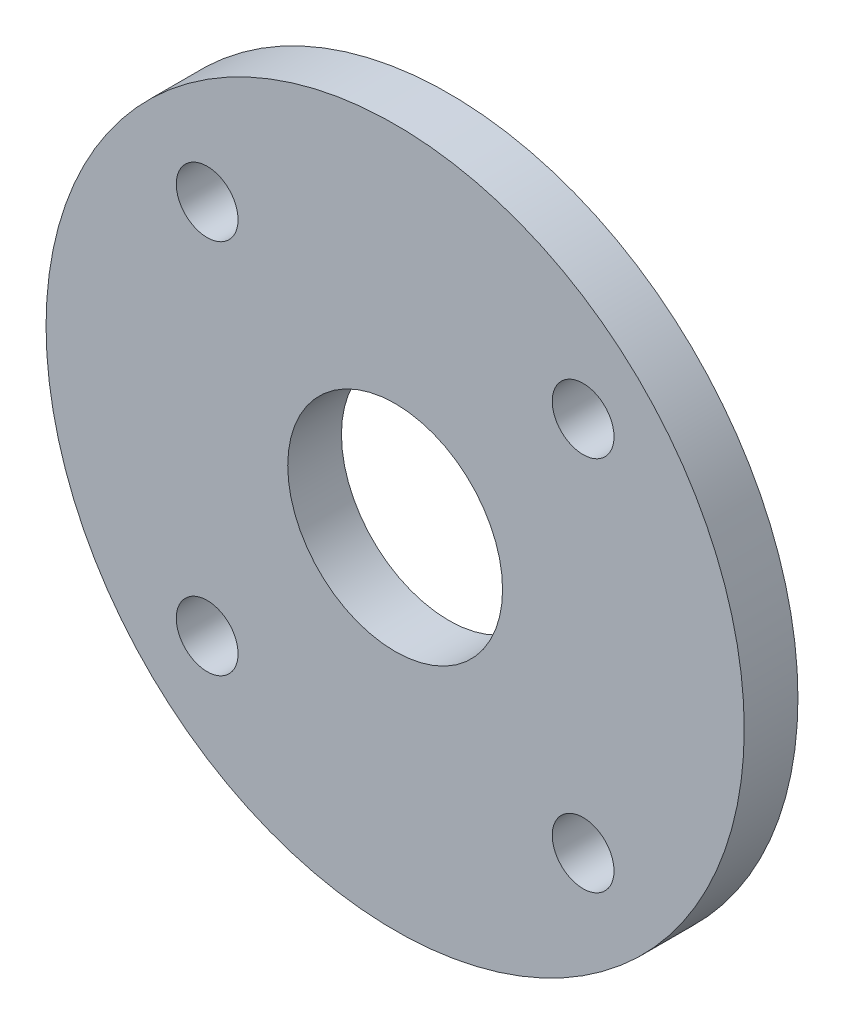
ISO-10303-21;
HEADER;
FILE_DESCRIPTION(('STEP AP214'),'2;1');
FILE_NAME('part.step','',(''),(''),'','','');
FILE_SCHEMA(('AUTOMOTIVE_DESIGN { 1 0 10303 214 1 1 1 1 }'));
ENDSEC;
DATA;
#1=APPLICATION_CONTEXT('core data for automotive mechanical design processes');
#2=APPLICATION_PROTOCOL_DEFINITION('international standard','automotive_design',2000,#1);
#3=PRODUCT_CONTEXT('',#1,'mechanical');
#4=PRODUCT('Part','Part','',(#3));
#5=PRODUCT_RELATED_PRODUCT_CATEGORY('part','',(#4));
#6=PRODUCT_DEFINITION_FORMATION('','',#4);
#7=PRODUCT_DEFINITION_CONTEXT('part definition',#1,'design');
#8=PRODUCT_DEFINITION('design','',#6,#7);
#9=PRODUCT_DEFINITION_SHAPE('','',#8);
#10=(LENGTH_UNIT() NAMED_UNIT(*) SI_UNIT(.MILLI.,.METRE.));
#11=(NAMED_UNIT(*) PLANE_ANGLE_UNIT() SI_UNIT($,.RADIAN.));
#12=(NAMED_UNIT(*) SI_UNIT($,.STERADIAN.) SOLID_ANGLE_UNIT());
#13=UNCERTAINTY_MEASURE_WITH_UNIT(LENGTH_MEASURE(1.E-05),#10,'distance_accuracy_value','');
#14=(GEOMETRIC_REPRESENTATION_CONTEXT(3) GLOBAL_UNCERTAINTY_ASSIGNED_CONTEXT((#13)) GLOBAL_UNIT_ASSIGNED_CONTEXT((#10,
#11,#12)) REPRESENTATION_CONTEXT('',''));
#15=CARTESIAN_POINT('',(0.,0.,0.));
#16=DIRECTION('',(0.,0.,1.));
#17=DIRECTION('',(1.,0.,0.));
#18=AXIS2_PLACEMENT_3D('',#15,#16,#17);
#19=CARTESIAN_POINT('',(0.,0.,2.));
#20=DIRECTION('',(0.,0.,1.));
#21=DIRECTION('',(1.,0.,0.));
#22=AXIS2_PLACEMENT_3D('',#19,#20,#21);
#23=PLANE('',#22);
#24=CARTESIAN_POINT('',(7.,-7.,2.));
#25=DIRECTION('',(0.,0.,1.));
#26=DIRECTION('',(1.,0.,0.));
#27=AXIS2_PLACEMENT_3D('',#24,#25,#26);
#28=CIRCLE('',#27,1.15);
#29=CARTESIAN_POINT('',(8.15,-7.,2.));
#30=VERTEX_POINT('',#29);
#31=EDGE_CURVE('E72',#30,#30,#28,.T.);
#32=ORIENTED_EDGE('',*,*,#31,.F.);
#33=EDGE_LOOP('',(#32));
#34=FACE_BOUND('',#33,.T.);
#35=CARTESIAN_POINT('',(-7.,-7.,2.));
#36=DIRECTION('',(0.,0.,1.));
#37=DIRECTION('',(1.,0.,0.));
#38=AXIS2_PLACEMENT_3D('',#35,#36,#37);
#39=CIRCLE('',#38,1.15);
#40=CARTESIAN_POINT('',(-5.85,-7.,2.));
#41=VERTEX_POINT('',#40);
#42=EDGE_CURVE('E73',#41,#41,#39,.T.);
#43=ORIENTED_EDGE('',*,*,#42,.F.);
#44=EDGE_LOOP('',(#43));
#45=FACE_BOUND('',#44,.T.);
#46=CARTESIAN_POINT('',(-7.,7.,2.));
#47=DIRECTION('',(0.,0.,1.));
#48=DIRECTION('',(1.,0.,0.));
#49=AXIS2_PLACEMENT_3D('',#46,#47,#48);
#50=CIRCLE('',#49,1.15);
#51=CARTESIAN_POINT('',(-5.85,7.,2.));
#52=VERTEX_POINT('',#51);
#53=EDGE_CURVE('E78',#52,#52,#50,.T.);
#54=ORIENTED_EDGE('',*,*,#53,.F.);
#55=EDGE_LOOP('',(#54));
#56=FACE_BOUND('',#55,.T.);
#57=CARTESIAN_POINT('',(7.,7.,2.));
#58=DIRECTION('',(0.,0.,1.));
#59=DIRECTION('',(1.,0.,0.));
#60=AXIS2_PLACEMENT_3D('',#57,#58,#59);
#61=CIRCLE('',#60,1.15);
#62=CARTESIAN_POINT('',(8.15,7.,2.));
#63=VERTEX_POINT('',#62);
#64=EDGE_CURVE('E83',#63,#63,#61,.T.);
#65=ORIENTED_EDGE('',*,*,#64,.F.);
#66=EDGE_LOOP('',(#65));
#67=FACE_BOUND('',#66,.T.);
#68=CARTESIAN_POINT('',(0.,0.,2.));
#69=DIRECTION('',(0.,0.,1.));
#70=DIRECTION('',(1.,0.,0.));
#71=AXIS2_PLACEMENT_3D('',#68,#69,#70);
#72=CIRCLE('',#71,13.);
#73=CARTESIAN_POINT('',(13.,0.,2.));
#74=VERTEX_POINT('',#73);
#75=EDGE_CURVE('E10',#74,#74,#72,.T.);
#76=ORIENTED_EDGE('',*,*,#75,.T.);
#77=EDGE_LOOP('',(#76));
#78=FACE_BOUND('',#77,.T.);
#79=CARTESIAN_POINT('',(0.,0.,2.));
#80=DIRECTION('',(0.,0.,1.));
#81=DIRECTION('',(1.,0.,0.));
#82=AXIS2_PLACEMENT_3D('',#79,#80,#81);
#83=CIRCLE('',#82,4.);
#84=CARTESIAN_POINT('',(4.,0.,2.));
#85=VERTEX_POINT('',#84);
#86=EDGE_CURVE('E53',#85,#85,#83,.T.);
#87=ORIENTED_EDGE('',*,*,#86,.F.);
#88=EDGE_LOOP('',(#87));
#89=FACE_BOUND('',#88,.T.);
#90=ADVANCED_FACE('F41',(#34,#45,#56,#67,#78,#89),#23,.T.);
#91=CARTESIAN_POINT('',(0.,0.,0.));
#92=DIRECTION('',(0.,0.,1.));
#93=DIRECTION('',(1.,0.,0.));
#94=AXIS2_PLACEMENT_3D('',#91,#92,#93);
#95=PLANE('',#94);
#96=CARTESIAN_POINT('',(7.,-7.,0.));
#97=DIRECTION('',(0.,0.,1.));
#98=DIRECTION('',(1.,0.,0.));
#99=AXIS2_PLACEMENT_3D('',#96,#97,#98);
#100=CIRCLE('',#99,2.1);
#101=CARTESIAN_POINT('',(9.1,-7.,0.));
#102=VERTEX_POINT('',#101);
#103=EDGE_CURVE('E134',#102,#102,#100,.T.);
#104=ORIENTED_EDGE('',*,*,#103,.T.);
#105=EDGE_LOOP('',(#104));
#106=FACE_BOUND('',#105,.T.);
#107=CARTESIAN_POINT('',(-7.,-7.,0.));
#108=DIRECTION('',(0.,0.,1.));
#109=DIRECTION('',(1.,0.,0.));
#110=AXIS2_PLACEMENT_3D('',#107,#108,#109);
#111=CIRCLE('',#110,2.1);
#112=CARTESIAN_POINT('',(-4.9,-7.,0.));
#113=VERTEX_POINT('',#112);
#114=EDGE_CURVE('E138',#113,#113,#111,.T.);
#115=ORIENTED_EDGE('',*,*,#114,.T.);
#116=EDGE_LOOP('',(#115));
#117=FACE_BOUND('',#116,.T.);
#118=CARTESIAN_POINT('',(-7.,7.,0.));
#119=DIRECTION('',(0.,0.,1.));
#120=DIRECTION('',(1.,0.,0.));
#121=AXIS2_PLACEMENT_3D('',#118,#119,#120);
#122=CIRCLE('',#121,2.1);
#123=CARTESIAN_POINT('',(-4.9,7.,0.));
#124=VERTEX_POINT('',#123);
#125=EDGE_CURVE('E130',#124,#124,#122,.T.);
#126=ORIENTED_EDGE('',*,*,#125,.T.);
#127=EDGE_LOOP('',(#126));
#128=FACE_BOUND('',#127,.T.);
#129=CARTESIAN_POINT('',(7.,7.,0.));
#130=DIRECTION('',(0.,0.,1.));
#131=DIRECTION('',(1.,0.,0.));
#132=AXIS2_PLACEMENT_3D('',#129,#130,#131);
#133=CIRCLE('',#132,2.1);
#134=CARTESIAN_POINT('',(9.1,7.,0.));
#135=VERTEX_POINT('',#134);
#136=EDGE_CURVE('E123',#135,#135,#133,.T.);
#137=ORIENTED_EDGE('',*,*,#136,.T.);
#138=EDGE_LOOP('',(#137));
#139=FACE_BOUND('',#138,.T.);
#140=CARTESIAN_POINT('',(0.,0.,0.));
#141=DIRECTION('',(0.,0.,1.));
#142=DIRECTION('',(1.,0.,0.));
#143=AXIS2_PLACEMENT_3D('',#140,#141,#142);
#144=CIRCLE('',#143,13.);
#145=CARTESIAN_POINT('',(13.,0.,0.));
#146=VERTEX_POINT('',#145);
#147=EDGE_CURVE('E47',#146,#146,#144,.T.);
#148=ORIENTED_EDGE('',*,*,#147,.F.);
#149=EDGE_LOOP('',(#148));
#150=FACE_BOUND('',#149,.T.);
#151=CARTESIAN_POINT('',(0.,0.,0.));
#152=DIRECTION('',(0.,0.,1.));
#153=DIRECTION('',(1.,0.,0.));
#154=AXIS2_PLACEMENT_3D('',#151,#152,#153);
#155=CIRCLE('',#154,4.);
#156=CARTESIAN_POINT('',(4.,0.,0.));
#157=VERTEX_POINT('',#156);
#158=EDGE_CURVE('E60',#157,#157,#155,.T.);
#159=ORIENTED_EDGE('',*,*,#158,.T.);
#160=EDGE_LOOP('',(#159));
#161=FACE_BOUND('',#160,.T.);
#162=ADVANCED_FACE('F95',(#106,#117,#128,#139,#150,#161),#95,.F.);
#163=CARTESIAN_POINT('',(0.,0.,2.));
#164=DIRECTION('',(0.,0.,-1.));
#165=DIRECTION('',(-1.,0.,0.));
#166=AXIS2_PLACEMENT_3D('',#163,#164,#165);
#167=CYLINDRICAL_SURFACE('',#166,13.);
#168=ORIENTED_EDGE('',*,*,#75,.F.);
#169=EDGE_LOOP('',(#168));
#170=FACE_BOUND('',#169,.T.);
#171=ORIENTED_EDGE('',*,*,#147,.T.);
#172=EDGE_LOOP('',(#171));
#173=FACE_BOUND('',#172,.T.);
#174=ADVANCED_FACE('F43',(#170,#173),#167,.T.);
#175=CARTESIAN_POINT('',(0.,0.,2.));
#176=DIRECTION('',(0.,0.,-1.));
#177=DIRECTION('',(-1.,0.,0.));
#178=AXIS2_PLACEMENT_3D('',#175,#176,#177);
#179=CYLINDRICAL_SURFACE('',#178,4.);
#180=ORIENTED_EDGE('',*,*,#86,.T.);
#181=EDGE_LOOP('',(#180));
#182=FACE_BOUND('',#181,.T.);
#183=ORIENTED_EDGE('',*,*,#158,.F.);
#184=EDGE_LOOP('',(#183));
#185=FACE_BOUND('',#184,.T.);
#186=ADVANCED_FACE('F94',(#182,#185),#179,.F.);
#187=CARTESIAN_POINT('',(7.,7.,2.));
#188=DIRECTION('',(0.,0.,-1.));
#189=DIRECTION('',(-1.,0.,0.));
#190=AXIS2_PLACEMENT_3D('',#187,#188,#189);
#191=CYLINDRICAL_SURFACE('',#190,1.15);
#192=CARTESIAN_POINT('',(7.,7.,0.35));
#193=DIRECTION('',(0.,0.,1.));
#194=DIRECTION('',(1.,0.,0.));
#195=AXIS2_PLACEMENT_3D('',#192,#193,#194);
#196=CIRCLE('',#195,1.15);
#197=CARTESIAN_POINT('',(8.15,7.,0.35));
#198=VERTEX_POINT('',#197);
#199=EDGE_CURVE('E44',#198,#198,#196,.T.);
#200=ORIENTED_EDGE('',*,*,#199,.F.);
#201=EDGE_LOOP('',(#200));
#202=FACE_BOUND('',#201,.T.);
#203=ORIENTED_EDGE('',*,*,#64,.T.);
#204=EDGE_LOOP('',(#203));
#205=FACE_BOUND('',#204,.T.);
#206=ADVANCED_FACE('F96',(#202,#205),#191,.F.);
#207=CARTESIAN_POINT('',(-7.,7.,2.));
#208=DIRECTION('',(0.,0.,-1.));
#209=DIRECTION('',(-1.,0.,0.));
#210=AXIS2_PLACEMENT_3D('',#207,#208,#209);
#211=CYLINDRICAL_SURFACE('',#210,1.15);
#212=CARTESIAN_POINT('',(-7.,7.,0.35));
#213=DIRECTION('',(0.,0.,1.));
#214=DIRECTION('',(1.,0.,0.));
#215=AXIS2_PLACEMENT_3D('',#212,#213,#214);
#216=CIRCLE('',#215,1.15);
#217=CARTESIAN_POINT('',(-5.85,7.,0.35));
#218=VERTEX_POINT('',#217);
#219=EDGE_CURVE('E66',#218,#218,#216,.T.);
#220=ORIENTED_EDGE('',*,*,#219,.F.);
#221=EDGE_LOOP('',(#220));
#222=FACE_BOUND('',#221,.T.);
#223=ORIENTED_EDGE('',*,*,#53,.T.);
#224=EDGE_LOOP('',(#223));
#225=FACE_BOUND('',#224,.T.);
#226=ADVANCED_FACE('F103',(#222,#225),#211,.F.);
#227=CARTESIAN_POINT('',(-7.,-7.,2.));
#228=DIRECTION('',(0.,0.,-1.));
#229=DIRECTION('',(-1.,0.,0.));
#230=AXIS2_PLACEMENT_3D('',#227,#228,#229);
#231=CYLINDRICAL_SURFACE('',#230,1.15);
#232=CARTESIAN_POINT('',(-7.,-7.,0.35));
#233=DIRECTION('',(0.,0.,1.));
#234=DIRECTION('',(1.,0.,0.));
#235=AXIS2_PLACEMENT_3D('',#232,#233,#234);
#236=CIRCLE('',#235,1.15);
#237=CARTESIAN_POINT('',(-5.85,-7.,0.35));
#238=VERTEX_POINT('',#237);
#239=EDGE_CURVE('E64',#238,#238,#236,.T.);
#240=ORIENTED_EDGE('',*,*,#239,.F.);
#241=EDGE_LOOP('',(#240));
#242=FACE_BOUND('',#241,.T.);
#243=ORIENTED_EDGE('',*,*,#42,.T.);
#244=EDGE_LOOP('',(#243));
#245=FACE_BOUND('',#244,.T.);
#246=ADVANCED_FACE('F187',(#242,#245),#231,.F.);
#247=CARTESIAN_POINT('',(7.,-7.,2.));
#248=DIRECTION('',(0.,0.,-1.));
#249=DIRECTION('',(-1.,0.,0.));
#250=AXIS2_PLACEMENT_3D('',#247,#248,#249);
#251=CYLINDRICAL_SURFACE('',#250,1.15);
#252=CARTESIAN_POINT('',(7.,-7.,0.35));
#253=DIRECTION('',(0.,0.,1.));
#254=DIRECTION('',(1.,0.,0.));
#255=AXIS2_PLACEMENT_3D('',#252,#253,#254);
#256=CIRCLE('',#255,1.15);
#257=CARTESIAN_POINT('',(8.15,-7.,0.35));
#258=VERTEX_POINT('',#257);
#259=EDGE_CURVE('E58',#258,#258,#256,.T.);
#260=ORIENTED_EDGE('',*,*,#259,.F.);
#261=EDGE_LOOP('',(#260));
#262=FACE_BOUND('',#261,.T.);
#263=ORIENTED_EDGE('',*,*,#31,.T.);
#264=EDGE_LOOP('',(#263));
#265=FACE_BOUND('',#264,.T.);
#266=ADVANCED_FACE('F174',(#262,#265),#251,.F.);
#267=CARTESIAN_POINT('',(7.,-7.,0.35));
#268=DIRECTION('',(0.,0.,-1.));
#269=DIRECTION('',(-1.,0.,0.));
#270=AXIS2_PLACEMENT_3D('',#267,#268,#269);
#271=CYLINDRICAL_SURFACE('',#270,2.1);
#272=CARTESIAN_POINT('',(7.,-7.,0.35));
#273=DIRECTION('',(0.,0.,1.));
#274=DIRECTION('',(1.,0.,0.));
#275=AXIS2_PLACEMENT_3D('',#272,#273,#274);
#276=CIRCLE('',#275,2.1);
#277=CARTESIAN_POINT('',(9.1,-7.,0.35));
#278=VERTEX_POINT('',#277);
#279=EDGE_CURVE('E128',#278,#278,#276,.T.);
#280=ORIENTED_EDGE('',*,*,#279,.T.);
#281=EDGE_LOOP('',(#280));
#282=FACE_BOUND('',#281,.T.);
#283=ORIENTED_EDGE('',*,*,#103,.F.);
#284=EDGE_LOOP('',(#283));
#285=FACE_BOUND('',#284,.T.);
#286=ADVANCED_FACE('F168',(#282,#285),#271,.F.);
#287=CARTESIAN_POINT('',(7.,-7.,0.35));
#288=DIRECTION('',(0.,0.,1.));
#289=DIRECTION('',(1.,0.,0.));
#290=AXIS2_PLACEMENT_3D('',#287,#288,#289);
#291=PLANE('',#290);
#292=ORIENTED_EDGE('',*,*,#259,.T.);
#293=EDGE_LOOP('',(#292));
#294=FACE_BOUND('',#293,.T.);
#295=ORIENTED_EDGE('',*,*,#279,.F.);
#296=EDGE_LOOP('',(#295));
#297=FACE_BOUND('',#296,.T.);
#298=ADVANCED_FACE('F170',(#294,#297),#291,.F.);
#299=CARTESIAN_POINT('',(-7.,-7.,0.35));
#300=DIRECTION('',(0.,0.,-1.));
#301=DIRECTION('',(-1.,0.,0.));
#302=AXIS2_PLACEMENT_3D('',#299,#300,#301);
#303=CYLINDRICAL_SURFACE('',#302,2.1);
#304=CARTESIAN_POINT('',(-7.,-7.,0.35));
#305=DIRECTION('',(0.,0.,1.));
#306=DIRECTION('',(1.,0.,0.));
#307=AXIS2_PLACEMENT_3D('',#304,#305,#306);
#308=CIRCLE('',#307,2.1);
#309=CARTESIAN_POINT('',(-4.9,-7.,0.35));
#310=VERTEX_POINT('',#309);
#311=EDGE_CURVE('E136',#310,#310,#308,.T.);
#312=ORIENTED_EDGE('',*,*,#311,.T.);
#313=EDGE_LOOP('',(#312));
#314=FACE_BOUND('',#313,.T.);
#315=ORIENTED_EDGE('',*,*,#114,.F.);
#316=EDGE_LOOP('',(#315));
#317=FACE_BOUND('',#316,.T.);
#318=ADVANCED_FACE('F165',(#314,#317),#303,.F.);
#319=CARTESIAN_POINT('',(-7.,-7.,0.35));
#320=DIRECTION('',(0.,0.,1.));
#321=DIRECTION('',(1.,0.,0.));
#322=AXIS2_PLACEMENT_3D('',#319,#320,#321);
#323=PLANE('',#322);
#324=ORIENTED_EDGE('',*,*,#239,.T.);
#325=EDGE_LOOP('',(#324));
#326=FACE_BOUND('',#325,.T.);
#327=ORIENTED_EDGE('',*,*,#311,.F.);
#328=EDGE_LOOP('',(#327));
#329=FACE_BOUND('',#328,.T.);
#330=ADVANCED_FACE('F153',(#326,#329),#323,.F.);
#331=CARTESIAN_POINT('',(-7.,7.,0.35));
#332=DIRECTION('',(0.,0.,-1.));
#333=DIRECTION('',(-1.,0.,0.));
#334=AXIS2_PLACEMENT_3D('',#331,#332,#333);
#335=CYLINDRICAL_SURFACE('',#334,2.1);
#336=CARTESIAN_POINT('',(-7.,7.,0.35));
#337=DIRECTION('',(0.,0.,1.));
#338=DIRECTION('',(1.,0.,0.));
#339=AXIS2_PLACEMENT_3D('',#336,#337,#338);
#340=CIRCLE('',#339,2.1);
#341=CARTESIAN_POINT('',(-4.9,7.,0.35));
#342=VERTEX_POINT('',#341);
#343=EDGE_CURVE('E142',#342,#342,#340,.T.);
#344=ORIENTED_EDGE('',*,*,#343,.T.);
#345=EDGE_LOOP('',(#344));
#346=FACE_BOUND('',#345,.T.);
#347=ORIENTED_EDGE('',*,*,#125,.F.);
#348=EDGE_LOOP('',(#347));
#349=FACE_BOUND('',#348,.T.);
#350=ADVANCED_FACE('F147',(#346,#349),#335,.F.);
#351=CARTESIAN_POINT('',(-7.,7.,0.35));
#352=DIRECTION('',(0.,0.,1.));
#353=DIRECTION('',(1.,0.,0.));
#354=AXIS2_PLACEMENT_3D('',#351,#352,#353);
#355=PLANE('',#354);
#356=ORIENTED_EDGE('',*,*,#219,.T.);
#357=EDGE_LOOP('',(#356));
#358=FACE_BOUND('',#357,.T.);
#359=ORIENTED_EDGE('',*,*,#343,.F.);
#360=EDGE_LOOP('',(#359));
#361=FACE_BOUND('',#360,.T.);
#362=ADVANCED_FACE('F155',(#358,#361),#355,.F.);
#363=CARTESIAN_POINT('',(7.,7.,0.35));
#364=DIRECTION('',(0.,0.,-1.));
#365=DIRECTION('',(-1.,0.,0.));
#366=AXIS2_PLACEMENT_3D('',#363,#364,#365);
#367=CYLINDRICAL_SURFACE('',#366,2.1);
#368=CARTESIAN_POINT('',(7.,7.,0.35));
#369=DIRECTION('',(0.,0.,1.));
#370=DIRECTION('',(1.,0.,0.));
#371=AXIS2_PLACEMENT_3D('',#368,#369,#370);
#372=CIRCLE('',#371,2.1);
#373=CARTESIAN_POINT('',(9.1,7.,0.35));
#374=VERTEX_POINT('',#373);
#375=EDGE_CURVE('E61',#374,#374,#372,.T.);
#376=ORIENTED_EDGE('',*,*,#375,.T.);
#377=EDGE_LOOP('',(#376));
#378=FACE_BOUND('',#377,.T.);
#379=ORIENTED_EDGE('',*,*,#136,.F.);
#380=EDGE_LOOP('',(#379));
#381=FACE_BOUND('',#380,.T.);
#382=ADVANCED_FACE('F159',(#378,#381),#367,.F.);
#383=CARTESIAN_POINT('',(7.,7.,0.35));
#384=DIRECTION('',(0.,0.,1.));
#385=DIRECTION('',(1.,0.,0.));
#386=AXIS2_PLACEMENT_3D('',#383,#384,#385);
#387=PLANE('',#386);
#388=ORIENTED_EDGE('',*,*,#199,.T.);
#389=EDGE_LOOP('',(#388));
#390=FACE_BOUND('',#389,.T.);
#391=ORIENTED_EDGE('',*,*,#375,.F.);
#392=EDGE_LOOP('',(#391));
#393=FACE_BOUND('',#392,.T.);
#394=ADVANCED_FACE('F177',(#390,#393),#387,.F.);
#395=CLOSED_SHELL('',(#90,#162,#174,#186,#206,#226,#246,#266,#286,#298,#318,#330,#350,#362,#382,#394));
#396=MANIFOLD_SOLID_BREP('B2',#395);
#397=ADVANCED_BREP_SHAPE_REPRESENTATION('',(#18,#396),#14);
#398=SHAPE_DEFINITION_REPRESENTATION(#9,#397);
ENDSEC;
END-ISO-10303-21;
